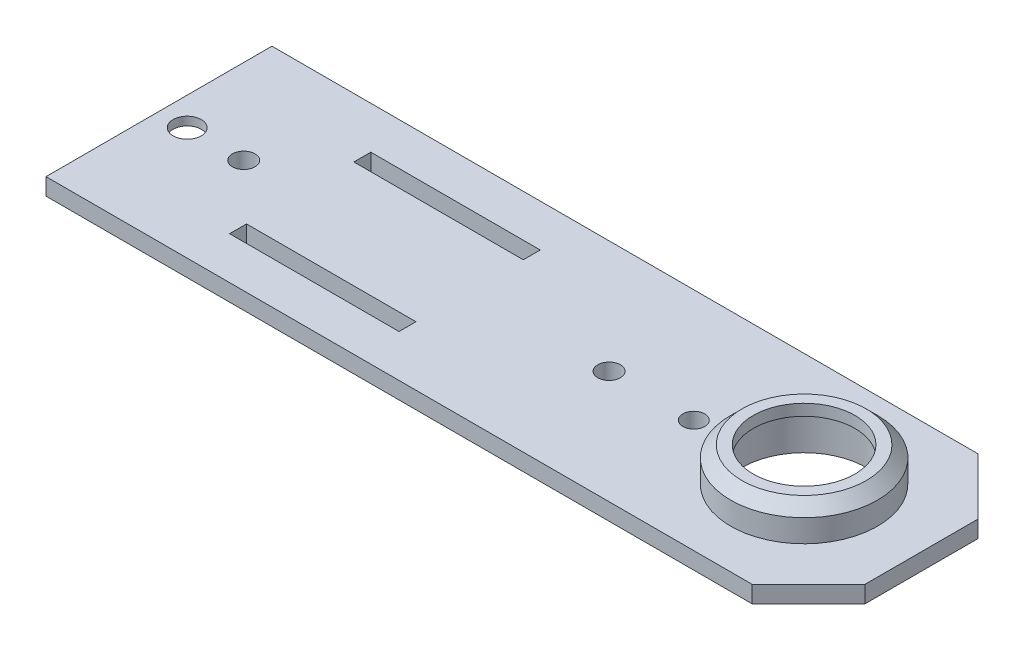
ISO-10303-21;
HEADER;
FILE_DESCRIPTION(('STEP AP214'),'2;1');
FILE_NAME('part.step','',(''),(''),'','','');
FILE_SCHEMA(('AUTOMOTIVE_DESIGN { 1 0 10303 214 1 1 1 1 }'));
ENDSEC;
DATA;
#1=APPLICATION_CONTEXT('core data for automotive mechanical design processes');
#2=APPLICATION_PROTOCOL_DEFINITION('international standard','automotive_design',2000,#1);
#3=PRODUCT_CONTEXT('',#1,'mechanical');
#4=PRODUCT('Part','Part','',(#3));
#5=PRODUCT_RELATED_PRODUCT_CATEGORY('part','',(#4));
#6=PRODUCT_DEFINITION_FORMATION('','',#4);
#7=PRODUCT_DEFINITION_CONTEXT('part definition',#1,'design');
#8=PRODUCT_DEFINITION('design','',#6,#7);
#9=PRODUCT_DEFINITION_SHAPE('','',#8);
#10=(LENGTH_UNIT() NAMED_UNIT(*) SI_UNIT(.MILLI.,.METRE.));
#11=(NAMED_UNIT(*) PLANE_ANGLE_UNIT() SI_UNIT($,.RADIAN.));
#12=(NAMED_UNIT(*) SI_UNIT($,.STERADIAN.) SOLID_ANGLE_UNIT());
#13=UNCERTAINTY_MEASURE_WITH_UNIT(LENGTH_MEASURE(1.E-05),#10,'distance_accuracy_value','');
#14=(GEOMETRIC_REPRESENTATION_CONTEXT(3) GLOBAL_UNCERTAINTY_ASSIGNED_CONTEXT((#13)) GLOBAL_UNIT_ASSIGNED_CONTEXT((#10,
#11,#12)) REPRESENTATION_CONTEXT('',''));
#15=CARTESIAN_POINT('',(0.,0.,0.));
#16=DIRECTION('',(0.,0.,1.));
#17=DIRECTION('',(1.,0.,0.));
#18=AXIS2_PLACEMENT_3D('',#15,#16,#17);
#19=CARTESIAN_POINT('',(-57.5,3.,-10.0000000000001));
#20=DIRECTION('',(0.,0.,-1.));
#21=DIRECTION('',(-1.,0.,0.));
#22=AXIS2_PLACEMENT_3D('',#19,#20,#21);
#23=PLANE('',#22);
#24=DIRECTION('',(-1.,0.,0.));
#25=VECTOR('',#24,1.);
#26=CARTESIAN_POINT('',(-67.5,1.5,-10.0000000000001));
#27=LINE('',#26,#25);
#28=CARTESIAN_POINT('',(-57.5,1.5,-10.0000000000001));
#29=VERTEX_POINT('',#28);
#30=CARTESIAN_POINT('',(-67.5,1.5,-10.0000000000001));
#31=VERTEX_POINT('',#30);
#32=EDGE_CURVE('E170',#29,#31,#27,.T.);
#33=ORIENTED_EDGE('',*,*,#32,.T.);
#34=DIRECTION('',(0.,-1.,0.));
#35=VECTOR('',#34,1.);
#36=CARTESIAN_POINT('',(-67.5,3.,-10.0000000000001));
#37=LINE('',#36,#35);
#38=CARTESIAN_POINT('',(-67.5,0.,-10.0000000000001));
#39=VERTEX_POINT('',#38);
#40=EDGE_CURVE('E188',#31,#39,#37,.T.);
#41=ORIENTED_EDGE('',*,*,#40,.T.);
#42=DIRECTION('',(1.,0.,0.));
#43=VECTOR('',#42,1.);
#44=CARTESIAN_POINT('',(-57.5,0.,-10.0000000000001));
#45=LINE('',#44,#43);
#46=CARTESIAN_POINT('',(-57.5,0.,-10.0000000000001));
#47=VERTEX_POINT('',#46);
#48=EDGE_CURVE('E266',#39,#47,#45,.T.);
#49=ORIENTED_EDGE('',*,*,#48,.T.);
#50=DIRECTION('',(0.,-1.,0.));
#51=VECTOR('',#50,1.);
#52=CARTESIAN_POINT('',(-57.5,3.,-10.0000000000001));
#53=LINE('',#52,#51);
#54=EDGE_CURVE('E186',#29,#47,#53,.T.);
#55=ORIENTED_EDGE('',*,*,#54,.F.);
#56=EDGE_LOOP('',(#33,#41,#49,#55));
#57=FACE_BOUND('',#56,.T.);
#58=ADVANCED_FACE('F38',(#57),#23,.F.);
#59=CARTESIAN_POINT('',(-57.5,3.,9.99999999999992));
#60=DIRECTION('',(1.,0.,0.));
#61=DIRECTION('',(0.,0.,-1.));
#62=AXIS2_PLACEMENT_3D('',#59,#60,#61);
#63=PLANE('',#62);
#64=DIRECTION('',(0.,0.,-1.));
#65=VECTOR('',#64,1.);
#66=CARTESIAN_POINT('',(-57.5,1.5,-10.0000000000001));
#67=LINE('',#66,#65);
#68=CARTESIAN_POINT('',(-57.5,1.5,9.99999999999992));
#69=VERTEX_POINT('',#68);
#70=EDGE_CURVE('E164',#69,#29,#67,.T.);
#71=ORIENTED_EDGE('',*,*,#70,.T.);
#72=ORIENTED_EDGE('',*,*,#54,.T.);
#73=DIRECTION('',(0.,0.,1.));
#74=VECTOR('',#73,1.);
#75=CARTESIAN_POINT('',(-57.5,0.,9.99999999999992));
#76=LINE('',#75,#74);
#77=CARTESIAN_POINT('',(-57.5,0.,9.99999999999992));
#78=VERTEX_POINT('',#77);
#79=EDGE_CURVE('E184',#47,#78,#76,.T.);
#80=ORIENTED_EDGE('',*,*,#79,.T.);
#81=DIRECTION('',(0.,-1.,0.));
#82=VECTOR('',#81,1.);
#83=CARTESIAN_POINT('',(-57.5,3.,9.99999999999992));
#84=LINE('',#83,#82);
#85=EDGE_CURVE('E178',#69,#78,#84,.T.);
#86=ORIENTED_EDGE('',*,*,#85,.F.);
#87=EDGE_LOOP('',(#71,#72,#80,#86));
#88=FACE_BOUND('',#87,.T.);
#89=ADVANCED_FACE('F182',(#88),#63,.F.);
#90=CARTESIAN_POINT('',(-67.5,3.,9.99999999999992));
#91=DIRECTION('',(0.,0.,1.));
#92=DIRECTION('',(1.,0.,0.));
#93=AXIS2_PLACEMENT_3D('',#90,#91,#92);
#94=PLANE('',#93);
#95=DIRECTION('',(1.,0.,0.));
#96=VECTOR('',#95,1.);
#97=CARTESIAN_POINT('',(-67.5,1.5,9.99999999999992));
#98=LINE('',#97,#96);
#99=CARTESIAN_POINT('',(-67.5,1.5,9.99999999999992));
#100=VERTEX_POINT('',#99);
#101=EDGE_CURVE('E167',#100,#69,#98,.T.);
#102=ORIENTED_EDGE('',*,*,#101,.T.);
#103=ORIENTED_EDGE('',*,*,#85,.T.);
#104=DIRECTION('',(-1.,0.,0.));
#105=VECTOR('',#104,1.);
#106=CARTESIAN_POINT('',(-67.5,0.,9.99999999999992));
#107=LINE('',#106,#105);
#108=CARTESIAN_POINT('',(-67.5,0.,9.99999999999992));
#109=VERTEX_POINT('',#108);
#110=EDGE_CURVE('E251',#78,#109,#107,.T.);
#111=ORIENTED_EDGE('',*,*,#110,.T.);
#112=DIRECTION('',(0.,-1.,0.));
#113=VECTOR('',#112,1.);
#114=CARTESIAN_POINT('',(-67.5,3.,9.99999999999992));
#115=LINE('',#114,#113);
#116=EDGE_CURVE('E180',#100,#109,#115,.T.);
#117=ORIENTED_EDGE('',*,*,#116,.F.);
#118=EDGE_LOOP('',(#102,#103,#111,#117));
#119=FACE_BOUND('',#118,.T.);
#120=ADVANCED_FACE('F176',(#119),#94,.F.);
#121=CARTESIAN_POINT('',(0.,3.,0.));
#122=DIRECTION('',(0.,-1.,0.));
#123=DIRECTION('',(0.,0.,-1.));
#124=AXIS2_PLACEMENT_3D('',#121,#122,#123);
#125=PLANE('',#124);
#126=DIRECTION('',(0.,0.,-1.));
#127=VECTOR('',#126,1.);
#128=CARTESIAN_POINT('',(-12.5,3.,12.5));
#129=LINE('',#128,#127);
#130=CARTESIAN_POINT('',(-12.5,3.,12.5));
#131=VERTEX_POINT('',#130);
#132=CARTESIAN_POINT('',(-12.5,3.,9.5));
#133=VERTEX_POINT('',#132);
#134=EDGE_CURVE('E291',#131,#133,#129,.T.);
#135=ORIENTED_EDGE('',*,*,#134,.F.);
#136=DIRECTION('',(1.,0.,0.));
#137=VECTOR('',#136,1.);
#138=CARTESIAN_POINT('',(-42.5,3.,12.5));
#139=LINE('',#138,#137);
#140=CARTESIAN_POINT('',(-42.5,3.,12.5));
#141=VERTEX_POINT('',#140);
#142=EDGE_CURVE('E299',#141,#131,#139,.T.);
#143=ORIENTED_EDGE('',*,*,#142,.F.);
#144=DIRECTION('',(0.,0.,1.));
#145=VECTOR('',#144,1.);
#146=CARTESIAN_POINT('',(-42.5,3.,12.5));
#147=LINE('',#146,#145);
#148=CARTESIAN_POINT('',(-42.5,3.,9.5));
#149=VERTEX_POINT('',#148);
#150=EDGE_CURVE('E296',#149,#141,#147,.T.);
#151=ORIENTED_EDGE('',*,*,#150,.F.);
#152=DIRECTION('',(-1.,0.,0.));
#153=VECTOR('',#152,1.);
#154=CARTESIAN_POINT('',(-42.5,3.,9.5));
#155=LINE('',#154,#153);
#156=EDGE_CURVE('E293',#133,#149,#155,.T.);
#157=ORIENTED_EDGE('',*,*,#156,.F.);
#158=EDGE_LOOP('',(#135,#143,#151,#157));
#159=FACE_BOUND('',#158,.T.);
#160=CARTESIAN_POINT('',(12.1857700369203,3.,0.));
#161=DIRECTION('',(0.,1.,0.));
#162=DIRECTION('',(0.,0.,1.));
#163=AXIS2_PLACEMENT_3D('',#160,#161,#162);
#164=CIRCLE('',#163,2.);
#165=CARTESIAN_POINT('',(12.1857700369203,3.,2.));
#166=VERTEX_POINT('',#165);
#167=EDGE_CURVE('E362',#166,#166,#164,.T.);
#168=ORIENTED_EDGE('',*,*,#167,.F.);
#169=EDGE_LOOP('',(#168));
#170=FACE_BOUND('',#169,.T.);
#171=CARTESIAN_POINT('',(27.1857700369203,3.,0.));
#172=DIRECTION('',(0.,1.,0.));
#173=DIRECTION('',(0.,0.,1.));
#174=AXIS2_PLACEMENT_3D('',#171,#172,#173);
#175=CIRCLE('',#174,1.93767259060063);
#176=CARTESIAN_POINT('',(27.1857700369203,3.,1.93767259060063));
#177=VERTEX_POINT('',#176);
#178=EDGE_CURVE('E261',#177,#177,#175,.T.);
#179=ORIENTED_EDGE('',*,*,#178,.F.);
#180=EDGE_LOOP('',(#179));
#181=FACE_BOUND('',#180,.T.);
#182=DIRECTION('',(1.,0.,0.));
#183=VECTOR('',#182,1.);
#184=CARTESIAN_POINT('',(-67.5,3.,20.));
#185=LINE('',#184,#183);
#186=CARTESIAN_POINT('',(-67.5,3.,20.));
#187=VERTEX_POINT('',#186);
#188=CARTESIAN_POINT('',(57.5,3.,20.));
#189=VERTEX_POINT('',#188);
#190=EDGE_CURVE('E225',#187,#189,#185,.T.);
#191=ORIENTED_EDGE('',*,*,#190,.T.);
#192=DIRECTION('',(-0.707106781186548,0.,0.707106781186547));
#193=VECTOR('',#192,1.);
#194=CARTESIAN_POINT('',(67.5,3.,9.99999999999999));
#195=LINE('',#194,#193);
#196=CARTESIAN_POINT('',(67.5,3.,9.99999999999999));
#197=VERTEX_POINT('',#196);
#198=EDGE_CURVE('E47',#189,#197,#195,.F.);
#199=ORIENTED_EDGE('',*,*,#198,.T.);
#200=DIRECTION('',(0.,0.,-1.));
#201=VECTOR('',#200,1.);
#202=CARTESIAN_POINT('',(67.5,3.,20.));
#203=LINE('',#202,#201);
#204=CARTESIAN_POINT('',(67.5,3.,-9.99999999999995));
#205=VERTEX_POINT('',#204);
#206=EDGE_CURVE('E223',#197,#205,#203,.T.);
#207=ORIENTED_EDGE('',*,*,#206,.T.);
#208=DIRECTION('',(0.707106781186546,0.,0.707106781186549));
#209=VECTOR('',#208,1.);
#210=CARTESIAN_POINT('',(57.5,3.,-20.));
#211=LINE('',#210,#209);
#212=CARTESIAN_POINT('',(57.5,3.,-20.));
#213=VERTEX_POINT('',#212);
#214=EDGE_CURVE('E62',#205,#213,#211,.F.);
#215=ORIENTED_EDGE('',*,*,#214,.T.);
#216=DIRECTION('',(-1.,0.,0.));
#217=VECTOR('',#216,1.);
#218=CARTESIAN_POINT('',(-67.5,3.,-20.));
#219=LINE('',#218,#217);
#220=CARTESIAN_POINT('',(-67.5,3.,-20.));
#221=VERTEX_POINT('',#220);
#222=EDGE_CURVE('E234',#213,#221,#219,.T.);
#223=ORIENTED_EDGE('',*,*,#222,.T.);
#224=DIRECTION('',(0.,0.,1.));
#225=VECTOR('',#224,1.);
#226=CARTESIAN_POINT('',(-67.5,3.,-10.0000000000001));
#227=LINE('',#226,#225);
#228=EDGE_CURVE('E254',#221,#187,#227,.T.);
#229=ORIENTED_EDGE('',*,*,#228,.T.);
#230=EDGE_LOOP('',(#191,#199,#207,#215,#223,#229));
#231=FACE_BOUND('',#230,.T.);
#232=DIRECTION('',(0.,0.,-1.));
#233=VECTOR('',#232,1.);
#234=CARTESIAN_POINT('',(-12.5,3.,-9.5));
#235=LINE('',#234,#233);
#236=CARTESIAN_POINT('',(-12.5,3.,-9.5));
#237=VERTEX_POINT('',#236);
#238=CARTESIAN_POINT('',(-12.5,3.,-12.5));
#239=VERTEX_POINT('',#238);
#240=EDGE_CURVE('E328',#237,#239,#235,.T.);
#241=ORIENTED_EDGE('',*,*,#240,.F.);
#242=DIRECTION('',(1.,0.,0.));
#243=VECTOR('',#242,1.);
#244=CARTESIAN_POINT('',(-42.5,3.,-9.5));
#245=LINE('',#244,#243);
#246=CARTESIAN_POINT('',(-42.5,3.,-9.5));
#247=VERTEX_POINT('',#246);
#248=EDGE_CURVE('E336',#247,#237,#245,.T.);
#249=ORIENTED_EDGE('',*,*,#248,.F.);
#250=DIRECTION('',(0.,0.,1.));
#251=VECTOR('',#250,1.);
#252=CARTESIAN_POINT('',(-42.5,3.,-9.5));
#253=LINE('',#252,#251);
#254=CARTESIAN_POINT('',(-42.5,3.,-12.5));
#255=VERTEX_POINT('',#254);
#256=EDGE_CURVE('E333',#255,#247,#253,.T.);
#257=ORIENTED_EDGE('',*,*,#256,.F.);
#258=DIRECTION('',(-1.,0.,0.));
#259=VECTOR('',#258,1.);
#260=CARTESIAN_POINT('',(-42.5,3.,-12.5));
#261=LINE('',#260,#259);
#262=EDGE_CURVE('E330',#239,#255,#261,.T.);
#263=ORIENTED_EDGE('',*,*,#262,.F.);
#264=EDGE_LOOP('',(#241,#249,#257,#263));
#265=FACE_BOUND('',#264,.T.);
#266=CARTESIAN_POINT('',(-52.5,3.,0.));
#267=DIRECTION('',(0.,1.,0.));
#268=DIRECTION('',(0.,0.,1.));
#269=AXIS2_PLACEMENT_3D('',#266,#267,#268);
#270=CIRCLE('',#269,2.);
#271=CARTESIAN_POINT('',(-52.5,3.,2.));
#272=VERTEX_POINT('',#271);
#273=EDGE_CURVE('E322',#272,#272,#270,.T.);
#274=ORIENTED_EDGE('',*,*,#273,.F.);
#275=EDGE_LOOP('',(#274));
#276=FACE_BOUND('',#275,.T.);
#277=CARTESIAN_POINT('',(46.7139511037718,3.,0.));
#278=DIRECTION('',(0.,-1.,0.));
#279=DIRECTION('',(0.,0.,-1.));
#280=AXIS2_PLACEMENT_3D('',#277,#278,#279);
#281=CIRCLE('',#280,13.);
#282=CARTESIAN_POINT('',(46.7139511037718,3.,-13.));
#283=VERTEX_POINT('',#282);
#284=EDGE_CURVE('E198',#283,#283,#281,.F.);
#285=ORIENTED_EDGE('',*,*,#284,.F.);
#286=EDGE_LOOP('',(#285));
#287=FACE_BOUND('',#286,.T.);
#288=CARTESIAN_POINT('',(-62.5,3.,0.));
#289=DIRECTION('',(0.,1.,0.));
#290=DIRECTION('',(0.,0.,1.));
#291=AXIS2_PLACEMENT_3D('',#288,#289,#290);
#292=CIRCLE('',#291,2.5);
#293=CARTESIAN_POINT('',(-62.5,3.,2.49999999999993));
#294=VERTEX_POINT('',#293);
#295=EDGE_CURVE('E755',#294,#294,#292,.T.);
#296=ORIENTED_EDGE('',*,*,#295,.F.);
#297=EDGE_LOOP('',(#296));
#298=FACE_BOUND('',#297,.T.);
#299=ADVANCED_FACE('F221',(#159,#170,#181,#231,#265,#276,#287,#298),#125,.F.);
#300=CARTESIAN_POINT('',(0.,0.,0.));
#301=DIRECTION('',(0.,-1.,0.));
#302=DIRECTION('',(0.,0.,-1.));
#303=AXIS2_PLACEMENT_3D('',#300,#301,#302);
#304=PLANE('',#303);
#305=DIRECTION('',(1.,0.,0.));
#306=VECTOR('',#305,1.);
#307=CARTESIAN_POINT('',(-42.5,0.,-9.5));
#308=LINE('',#307,#306);
#309=CARTESIAN_POINT('',(-42.5,0.,-9.5));
#310=VERTEX_POINT('',#309);
#311=CARTESIAN_POINT('',(-12.5,0.,-9.5));
#312=VERTEX_POINT('',#311);
#313=EDGE_CURVE('E331',#310,#312,#308,.T.);
#314=ORIENTED_EDGE('',*,*,#313,.T.);
#315=DIRECTION('',(0.,0.,-1.));
#316=VECTOR('',#315,1.);
#317=CARTESIAN_POINT('',(-12.5,0.,-9.5));
#318=LINE('',#317,#316);
#319=CARTESIAN_POINT('',(-12.5,0.,-12.5));
#320=VERTEX_POINT('',#319);
#321=EDGE_CURVE('E325',#312,#320,#318,.T.);
#322=ORIENTED_EDGE('',*,*,#321,.T.);
#323=DIRECTION('',(-1.,0.,0.));
#324=VECTOR('',#323,1.);
#325=CARTESIAN_POINT('',(-42.5,0.,-12.5));
#326=LINE('',#325,#324);
#327=CARTESIAN_POINT('',(-42.5,0.,-12.5));
#328=VERTEX_POINT('',#327);
#329=EDGE_CURVE('E341',#320,#328,#326,.T.);
#330=ORIENTED_EDGE('',*,*,#329,.T.);
#331=DIRECTION('',(0.,0.,1.));
#332=VECTOR('',#331,1.);
#333=CARTESIAN_POINT('',(-42.5,0.,-9.5));
#334=LINE('',#333,#332);
#335=EDGE_CURVE('E344',#328,#310,#334,.T.);
#336=ORIENTED_EDGE('',*,*,#335,.T.);
#337=EDGE_LOOP('',(#314,#322,#330,#336));
#338=FACE_BOUND('',#337,.T.);
#339=CARTESIAN_POINT('',(46.7139511037718,0.,0.));
#340=DIRECTION('',(0.,1.,0.));
#341=DIRECTION('',(0.,0.,1.));
#342=AXIS2_PLACEMENT_3D('',#339,#340,#341);
#343=CIRCLE('',#342,11.);
#344=CARTESIAN_POINT('',(46.7139511037718,0.,11.));
#345=VERTEX_POINT('',#344);
#346=EDGE_CURVE('E358',#345,#345,#343,.T.);
#347=ORIENTED_EDGE('',*,*,#346,.T.);
#348=EDGE_LOOP('',(#347));
#349=FACE_BOUND('',#348,.T.);
#350=CARTESIAN_POINT('',(27.1857700369203,0.,0.));
#351=DIRECTION('',(0.,1.,0.));
#352=DIRECTION('',(0.,0.,1.));
#353=AXIS2_PLACEMENT_3D('',#350,#351,#352);
#354=CIRCLE('',#353,1.93767259060063);
#355=CARTESIAN_POINT('',(27.1857700369203,0.,1.93767259060063));
#356=VERTEX_POINT('',#355);
#357=EDGE_CURVE('E365',#356,#356,#354,.T.);
#358=ORIENTED_EDGE('',*,*,#357,.T.);
#359=EDGE_LOOP('',(#358));
#360=FACE_BOUND('',#359,.T.);
#361=DIRECTION('',(0.,0.,-1.));
#362=VECTOR('',#361,1.);
#363=CARTESIAN_POINT('',(67.5,0.,20.));
#364=LINE('',#363,#362);
#365=CARTESIAN_POINT('',(67.5,0.,9.99999999999999));
#366=VERTEX_POINT('',#365);
#367=CARTESIAN_POINT('',(67.5,0.,-9.99999999999995));
#368=VERTEX_POINT('',#367);
#369=EDGE_CURVE('E244',#366,#368,#364,.T.);
#370=ORIENTED_EDGE('',*,*,#369,.F.);
#371=DIRECTION('',(0.707106781186548,0.,-0.707106781186547));
#372=VECTOR('',#371,1.);
#373=CARTESIAN_POINT('',(38.75,0.,38.75));
#374=LINE('',#373,#372);
#375=CARTESIAN_POINT('',(57.5,0.,20.));
#376=VERTEX_POINT('',#375);
#377=EDGE_CURVE('E214',#366,#376,#374,.F.);
#378=ORIENTED_EDGE('',*,*,#377,.T.);
#379=DIRECTION('',(1.,0.,0.));
#380=VECTOR('',#379,1.);
#381=CARTESIAN_POINT('',(-67.5,0.,20.));
#382=LINE('',#381,#380);
#383=CARTESIAN_POINT('',(-67.5,0.,20.));
#384=VERTEX_POINT('',#383);
#385=EDGE_CURVE('E235',#384,#376,#382,.T.);
#386=ORIENTED_EDGE('',*,*,#385,.F.);
#387=DIRECTION('',(0.,0.,1.));
#388=VECTOR('',#387,1.);
#389=CARTESIAN_POINT('',(-67.5,0.,20.));
#390=LINE('',#389,#388);
#391=EDGE_CURVE('E249',#109,#384,#390,.T.);
#392=ORIENTED_EDGE('',*,*,#391,.F.);
#393=ORIENTED_EDGE('',*,*,#110,.F.);
#394=ORIENTED_EDGE('',*,*,#79,.F.);
#395=ORIENTED_EDGE('',*,*,#48,.F.);
#396=DIRECTION('',(0.,0.,1.));
#397=VECTOR('',#396,1.);
#398=CARTESIAN_POINT('',(-67.5,0.,-10.0000000000001));
#399=LINE('',#398,#397);
#400=CARTESIAN_POINT('',(-67.5,0.,-20.));
#401=VERTEX_POINT('',#400);
#402=EDGE_CURVE('E263',#401,#39,#399,.T.);
#403=ORIENTED_EDGE('',*,*,#402,.F.);
#404=DIRECTION('',(-1.,0.,0.));
#405=VECTOR('',#404,1.);
#406=CARTESIAN_POINT('',(-67.5,0.,-20.));
#407=LINE('',#406,#405);
#408=CARTESIAN_POINT('',(57.5,0.,-20.));
#409=VERTEX_POINT('',#408);
#410=EDGE_CURVE('E260',#409,#401,#407,.T.);
#411=ORIENTED_EDGE('',*,*,#410,.F.);
#412=DIRECTION('',(-0.707106781186546,0.,-0.707106781186549));
#413=VECTOR('',#412,1.);
#414=CARTESIAN_POINT('',(38.7500000000001,0.,-38.75));
#415=LINE('',#414,#413);
#416=EDGE_CURVE('E212',#409,#368,#415,.F.);
#417=ORIENTED_EDGE('',*,*,#416,.T.);
#418=EDGE_LOOP('',(#370,#378,#386,#392,#393,#394,#395,#403,#411,#417));
#419=FACE_BOUND('',#418,.T.);
#420=CARTESIAN_POINT('',(12.1857700369203,0.,0.));
#421=DIRECTION('',(0.,1.,0.));
#422=DIRECTION('',(0.,0.,1.));
#423=AXIS2_PLACEMENT_3D('',#420,#421,#422);
#424=CIRCLE('',#423,2.);
#425=CARTESIAN_POINT('',(12.1857700369203,0.,2.));
#426=VERTEX_POINT('',#425);
#427=EDGE_CURVE('E361',#426,#426,#424,.T.);
#428=ORIENTED_EDGE('',*,*,#427,.T.);
#429=EDGE_LOOP('',(#428));
#430=FACE_BOUND('',#429,.T.);
#431=CARTESIAN_POINT('',(-52.5,0.,0.));
#432=DIRECTION('',(0.,1.,0.));
#433=DIRECTION('',(0.,0.,1.));
#434=AXIS2_PLACEMENT_3D('',#431,#432,#433);
#435=CIRCLE('',#434,2.);
#436=CARTESIAN_POINT('',(-52.5,0.,2.));
#437=VERTEX_POINT('',#436);
#438=EDGE_CURVE('E321',#437,#437,#435,.T.);
#439=ORIENTED_EDGE('',*,*,#438,.T.);
#440=EDGE_LOOP('',(#439));
#441=FACE_BOUND('',#440,.T.);
#442=DIRECTION('',(1.,0.,0.));
#443=VECTOR('',#442,1.);
#444=CARTESIAN_POINT('',(-42.5,0.,12.5));
#445=LINE('',#444,#443);
#446=CARTESIAN_POINT('',(-42.5,0.,12.5));
#447=VERTEX_POINT('',#446);
#448=CARTESIAN_POINT('',(-12.5,0.,12.5));
#449=VERTEX_POINT('',#448);
#450=EDGE_CURVE('E294',#447,#449,#445,.T.);
#451=ORIENTED_EDGE('',*,*,#450,.T.);
#452=DIRECTION('',(0.,0.,-1.));
#453=VECTOR('',#452,1.);
#454=CARTESIAN_POINT('',(-12.5,0.,12.5));
#455=LINE('',#454,#453);
#456=CARTESIAN_POINT('',(-12.5,0.,9.5));
#457=VERTEX_POINT('',#456);
#458=EDGE_CURVE('E290',#449,#457,#455,.T.);
#459=ORIENTED_EDGE('',*,*,#458,.T.);
#460=DIRECTION('',(-1.,0.,0.));
#461=VECTOR('',#460,1.);
#462=CARTESIAN_POINT('',(-42.5,0.,9.5));
#463=LINE('',#462,#461);
#464=CARTESIAN_POINT('',(-42.5,0.,9.5));
#465=VERTEX_POINT('',#464);
#466=EDGE_CURVE('E304',#457,#465,#463,.T.);
#467=ORIENTED_EDGE('',*,*,#466,.T.);
#468=DIRECTION('',(0.,0.,1.));
#469=VECTOR('',#468,1.);
#470=CARTESIAN_POINT('',(-42.5,0.,12.5));
#471=LINE('',#470,#469);
#472=EDGE_CURVE('E307',#465,#447,#471,.T.);
#473=ORIENTED_EDGE('',*,*,#472,.T.);
#474=EDGE_LOOP('',(#451,#459,#467,#473));
#475=FACE_BOUND('',#474,.T.);
#476=ADVANCED_FACE('F241',(#338,#349,#360,#419,#430,#441,#475),#304,.T.);
#477=CARTESIAN_POINT('',(67.5,3.,20.));
#478=DIRECTION('',(-1.,0.,0.));
#479=DIRECTION('',(0.,0.,1.));
#480=AXIS2_PLACEMENT_3D('',#477,#478,#479);
#481=PLANE('',#480);
#482=ORIENTED_EDGE('',*,*,#206,.F.);
#483=DIRECTION('',(0.,-1.,0.));
#484=VECTOR('',#483,1.);
#485=CARTESIAN_POINT('',(67.5,3.,9.99999999999999));
#486=LINE('',#485,#484);
#487=EDGE_CURVE('E209',#197,#366,#486,.T.);
#488=ORIENTED_EDGE('',*,*,#487,.T.);
#489=ORIENTED_EDGE('',*,*,#369,.T.);
#490=DIRECTION('',(0.,1.,0.));
#491=VECTOR('',#490,1.);
#492=CARTESIAN_POINT('',(67.5,3.,-9.99999999999995));
#493=LINE('',#492,#491);
#494=EDGE_CURVE('E207',#368,#205,#493,.T.);
#495=ORIENTED_EDGE('',*,*,#494,.T.);
#496=EDGE_LOOP('',(#482,#488,#489,#495));
#497=FACE_BOUND('',#496,.T.);
#498=ADVANCED_FACE('F230',(#497),#481,.F.);
#499=CARTESIAN_POINT('',(-67.5,3.,-20.));
#500=DIRECTION('',(0.,0.,1.));
#501=DIRECTION('',(1.,0.,0.));
#502=AXIS2_PLACEMENT_3D('',#499,#500,#501);
#503=PLANE('',#502);
#504=ORIENTED_EDGE('',*,*,#222,.F.);
#505=DIRECTION('',(0.,-1.,0.));
#506=VECTOR('',#505,1.);
#507=CARTESIAN_POINT('',(57.5,3.,-20.));
#508=LINE('',#507,#506);
#509=EDGE_CURVE('E11',#213,#409,#508,.T.);
#510=ORIENTED_EDGE('',*,*,#509,.T.);
#511=ORIENTED_EDGE('',*,*,#410,.T.);
#512=DIRECTION('',(0.,-1.,0.));
#513=VECTOR('',#512,1.);
#514=CARTESIAN_POINT('',(-67.5,3.,-20.));
#515=LINE('',#514,#513);
#516=EDGE_CURVE('E195',#221,#401,#515,.T.);
#517=ORIENTED_EDGE('',*,*,#516,.F.);
#518=EDGE_LOOP('',(#504,#510,#511,#517));
#519=FACE_BOUND('',#518,.T.);
#520=ADVANCED_FACE('F275',(#519),#503,.F.);
#521=CARTESIAN_POINT('',(-67.5,3.,20.));
#522=DIRECTION('',(1.,0.,0.));
#523=DIRECTION('',(0.,0.,-1.));
#524=AXIS2_PLACEMENT_3D('',#521,#522,#523);
#525=PLANE('',#524);
#526=ORIENTED_EDGE('',*,*,#391,.T.);
#527=DIRECTION('',(0.,-1.,0.));
#528=VECTOR('',#527,1.);
#529=CARTESIAN_POINT('',(-67.5,3.,20.));
#530=LINE('',#529,#528);
#531=EDGE_CURVE('E190',#187,#384,#530,.T.);
#532=ORIENTED_EDGE('',*,*,#531,.F.);
#533=ORIENTED_EDGE('',*,*,#228,.F.);
#534=ORIENTED_EDGE('',*,*,#516,.T.);
#535=ORIENTED_EDGE('',*,*,#402,.T.);
#536=ORIENTED_EDGE('',*,*,#40,.F.);
#537=DIRECTION('',(0.,0.,1.));
#538=VECTOR('',#537,1.);
#539=CARTESIAN_POINT('',(-67.5,1.5,-10.0000000000001));
#540=LINE('',#539,#538);
#541=EDGE_CURVE('E54',#31,#100,#540,.T.);
#542=ORIENTED_EDGE('',*,*,#541,.T.);
#543=ORIENTED_EDGE('',*,*,#116,.T.);
#544=EDGE_LOOP('',(#526,#532,#533,#534,#535,#536,#542,#543));
#545=FACE_BOUND('',#544,.T.);
#546=ADVANCED_FACE('F269',(#545),#525,.F.);
#547=CARTESIAN_POINT('',(-67.5,3.,20.));
#548=DIRECTION('',(0.,0.,-1.));
#549=DIRECTION('',(-1.,0.,0.));
#550=AXIS2_PLACEMENT_3D('',#547,#548,#549);
#551=PLANE('',#550);
#552=ORIENTED_EDGE('',*,*,#385,.T.);
#553=DIRECTION('',(0.,1.,0.));
#554=VECTOR('',#553,1.);
#555=CARTESIAN_POINT('',(57.5,3.,20.));
#556=LINE('',#555,#554);
#557=EDGE_CURVE('E216',#376,#189,#556,.T.);
#558=ORIENTED_EDGE('',*,*,#557,.T.);
#559=ORIENTED_EDGE('',*,*,#190,.F.);
#560=ORIENTED_EDGE('',*,*,#531,.T.);
#561=EDGE_LOOP('',(#552,#558,#559,#560));
#562=FACE_BOUND('',#561,.T.);
#563=ADVANCED_FACE('F247',(#562),#551,.F.);
#564=CARTESIAN_POINT('',(27.1857700369203,3.,0.));
#565=DIRECTION('',(0.,-1.,0.));
#566=DIRECTION('',(0.,0.,-1.));
#567=AXIS2_PLACEMENT_3D('',#564,#565,#566);
#568=CYLINDRICAL_SURFACE('',#567,1.93767259060063);
#569=ORIENTED_EDGE('',*,*,#178,.T.);
#570=EDGE_LOOP('',(#569));
#571=FACE_BOUND('',#570,.T.);
#572=ORIENTED_EDGE('',*,*,#357,.F.);
#573=EDGE_LOOP('',(#572));
#574=FACE_BOUND('',#573,.T.);
#575=ADVANCED_FACE('F374',(#571,#574),#568,.F.);
#576=CARTESIAN_POINT('',(12.1857700369203,3.,0.));
#577=DIRECTION('',(0.,-1.,0.));
#578=DIRECTION('',(0.,0.,-1.));
#579=AXIS2_PLACEMENT_3D('',#576,#577,#578);
#580=CYLINDRICAL_SURFACE('',#579,2.);
#581=ORIENTED_EDGE('',*,*,#167,.T.);
#582=EDGE_LOOP('',(#581));
#583=FACE_BOUND('',#582,.T.);
#584=ORIENTED_EDGE('',*,*,#427,.F.);
#585=EDGE_LOOP('',(#584));
#586=FACE_BOUND('',#585,.T.);
#587=ADVANCED_FACE('F376',(#583,#586),#580,.F.);
#588=CARTESIAN_POINT('',(46.7139511037718,3.,0.));
#589=DIRECTION('',(0.,-1.,0.));
#590=DIRECTION('',(0.,0.,-1.));
#591=AXIS2_PLACEMENT_3D('',#588,#589,#590);
#592=CYLINDRICAL_SURFACE('',#591,11.);
#593=ORIENTED_EDGE('',*,*,#346,.F.);
#594=EDGE_LOOP('',(#593));
#595=FACE_BOUND('',#594,.T.);
#596=CARTESIAN_POINT('',(46.7139511037718,7.,0.));
#597=DIRECTION('',(0.,1.,0.));
#598=DIRECTION('',(0.,0.,1.));
#599=AXIS2_PLACEMENT_3D('',#596,#597,#598);
#600=CIRCLE('',#599,11.);
#601=CARTESIAN_POINT('',(46.7139511037718,7.,11.));
#602=VERTEX_POINT('',#601);
#603=EDGE_CURVE('E286',#602,#602,#600,.T.);
#604=ORIENTED_EDGE('',*,*,#603,.T.);
#605=EDGE_LOOP('',(#604));
#606=FACE_BOUND('',#605,.T.);
#607=ADVANCED_FACE('F383',(#595,#606),#592,.F.);
#608=CARTESIAN_POINT('',(-12.5,3.,-9.5));
#609=DIRECTION('',(-1.,0.,0.));
#610=DIRECTION('',(0.,0.,1.));
#611=AXIS2_PLACEMENT_3D('',#608,#609,#610);
#612=PLANE('',#611);
#613=ORIENTED_EDGE('',*,*,#321,.F.);
#614=DIRECTION('',(0.,-1.,0.));
#615=VECTOR('',#614,1.);
#616=CARTESIAN_POINT('',(-12.5,3.,-9.5));
#617=LINE('',#616,#615);
#618=EDGE_CURVE('E338',#237,#312,#617,.T.);
#619=ORIENTED_EDGE('',*,*,#618,.F.);
#620=ORIENTED_EDGE('',*,*,#240,.T.);
#621=DIRECTION('',(0.,-1.,0.));
#622=VECTOR('',#621,1.);
#623=CARTESIAN_POINT('',(-12.5,3.,-12.5));
#624=LINE('',#623,#622);
#625=EDGE_CURVE('E355',#239,#320,#624,.T.);
#626=ORIENTED_EDGE('',*,*,#625,.T.);
#627=EDGE_LOOP('',(#613,#619,#620,#626));
#628=FACE_BOUND('',#627,.T.);
#629=ADVANCED_FACE('F474',(#628),#612,.T.);
#630=CARTESIAN_POINT('',(-42.5,3.,-12.5));
#631=DIRECTION('',(0.,0.,1.));
#632=DIRECTION('',(1.,0.,0.));
#633=AXIS2_PLACEMENT_3D('',#630,#631,#632);
#634=PLANE('',#633);
#635=ORIENTED_EDGE('',*,*,#329,.F.);
#636=ORIENTED_EDGE('',*,*,#625,.F.);
#637=ORIENTED_EDGE('',*,*,#262,.T.);
#638=DIRECTION('',(0.,-1.,0.));
#639=VECTOR('',#638,1.);
#640=CARTESIAN_POINT('',(-42.5,3.,-12.5));
#641=LINE('',#640,#639);
#642=EDGE_CURVE('E353',#255,#328,#641,.T.);
#643=ORIENTED_EDGE('',*,*,#642,.T.);
#644=EDGE_LOOP('',(#635,#636,#637,#643));
#645=FACE_BOUND('',#644,.T.);
#646=ADVANCED_FACE('F470',(#645),#634,.T.);
#647=CARTESIAN_POINT('',(-42.5,3.,-9.5));
#648=DIRECTION('',(1.,0.,0.));
#649=DIRECTION('',(0.,0.,-1.));
#650=AXIS2_PLACEMENT_3D('',#647,#648,#649);
#651=PLANE('',#650);
#652=ORIENTED_EDGE('',*,*,#335,.F.);
#653=ORIENTED_EDGE('',*,*,#642,.F.);
#654=ORIENTED_EDGE('',*,*,#256,.T.);
#655=DIRECTION('',(0.,-1.,0.));
#656=VECTOR('',#655,1.);
#657=CARTESIAN_POINT('',(-42.5,3.,-9.5));
#658=LINE('',#657,#656);
#659=EDGE_CURVE('E351',#247,#310,#658,.T.);
#660=ORIENTED_EDGE('',*,*,#659,.T.);
#661=EDGE_LOOP('',(#652,#653,#654,#660));
#662=FACE_BOUND('',#661,.T.);
#663=ADVANCED_FACE('F466',(#662),#651,.T.);
#664=CARTESIAN_POINT('',(-42.5,3.,-9.5));
#665=DIRECTION('',(0.,0.,-1.));
#666=DIRECTION('',(-1.,0.,0.));
#667=AXIS2_PLACEMENT_3D('',#664,#665,#666);
#668=PLANE('',#667);
#669=ORIENTED_EDGE('',*,*,#313,.F.);
#670=ORIENTED_EDGE('',*,*,#659,.F.);
#671=ORIENTED_EDGE('',*,*,#248,.T.);
#672=ORIENTED_EDGE('',*,*,#618,.T.);
#673=EDGE_LOOP('',(#669,#670,#671,#672));
#674=FACE_BOUND('',#673,.T.);
#675=ADVANCED_FACE('F462',(#674),#668,.T.);
#676=CARTESIAN_POINT('',(-52.5,3.,0.));
#677=DIRECTION('',(0.,-1.,0.));
#678=DIRECTION('',(0.,0.,-1.));
#679=AXIS2_PLACEMENT_3D('',#676,#677,#678);
#680=CYLINDRICAL_SURFACE('',#679,2.);
#681=ORIENTED_EDGE('',*,*,#273,.T.);
#682=EDGE_LOOP('',(#681));
#683=FACE_BOUND('',#682,.T.);
#684=ORIENTED_EDGE('',*,*,#438,.F.);
#685=EDGE_LOOP('',(#684));
#686=FACE_BOUND('',#685,.T.);
#687=ADVANCED_FACE('F458',(#683,#686),#680,.F.);
#688=CARTESIAN_POINT('',(-12.5,3.,12.5));
#689=DIRECTION('',(-1.,0.,0.));
#690=DIRECTION('',(0.,0.,1.));
#691=AXIS2_PLACEMENT_3D('',#688,#689,#690);
#692=PLANE('',#691);
#693=ORIENTED_EDGE('',*,*,#458,.F.);
#694=DIRECTION('',(0.,-1.,0.));
#695=VECTOR('',#694,1.);
#696=CARTESIAN_POINT('',(-12.5,3.,12.5));
#697=LINE('',#696,#695);
#698=EDGE_CURVE('E301',#131,#449,#697,.T.);
#699=ORIENTED_EDGE('',*,*,#698,.F.);
#700=ORIENTED_EDGE('',*,*,#134,.T.);
#701=DIRECTION('',(0.,-1.,0.));
#702=VECTOR('',#701,1.);
#703=CARTESIAN_POINT('',(-12.5,3.,9.5));
#704=LINE('',#703,#702);
#705=EDGE_CURVE('E318',#133,#457,#704,.T.);
#706=ORIENTED_EDGE('',*,*,#705,.T.);
#707=EDGE_LOOP('',(#693,#699,#700,#706));
#708=FACE_BOUND('',#707,.T.);
#709=ADVANCED_FACE('F454',(#708),#692,.T.);
#710=CARTESIAN_POINT('',(-42.5,3.,9.5));
#711=DIRECTION('',(0.,0.,1.));
#712=DIRECTION('',(1.,0.,0.));
#713=AXIS2_PLACEMENT_3D('',#710,#711,#712);
#714=PLANE('',#713);
#715=ORIENTED_EDGE('',*,*,#466,.F.);
#716=ORIENTED_EDGE('',*,*,#705,.F.);
#717=ORIENTED_EDGE('',*,*,#156,.T.);
#718=DIRECTION('',(0.,-1.,0.));
#719=VECTOR('',#718,1.);
#720=CARTESIAN_POINT('',(-42.5,3.,9.5));
#721=LINE('',#720,#719);
#722=EDGE_CURVE('E316',#149,#465,#721,.T.);
#723=ORIENTED_EDGE('',*,*,#722,.T.);
#724=EDGE_LOOP('',(#715,#716,#717,#723));
#725=FACE_BOUND('',#724,.T.);
#726=ADVANCED_FACE('F450',(#725),#714,.T.);
#727=CARTESIAN_POINT('',(-42.5,3.,12.5));
#728=DIRECTION('',(1.,0.,0.));
#729=DIRECTION('',(0.,0.,-1.));
#730=AXIS2_PLACEMENT_3D('',#727,#728,#729);
#731=PLANE('',#730);
#732=ORIENTED_EDGE('',*,*,#472,.F.);
#733=ORIENTED_EDGE('',*,*,#722,.F.);
#734=ORIENTED_EDGE('',*,*,#150,.T.);
#735=DIRECTION('',(0.,-1.,0.));
#736=VECTOR('',#735,1.);
#737=CARTESIAN_POINT('',(-42.5,3.,12.5));
#738=LINE('',#737,#736);
#739=EDGE_CURVE('E314',#141,#447,#738,.T.);
#740=ORIENTED_EDGE('',*,*,#739,.T.);
#741=EDGE_LOOP('',(#732,#733,#734,#740));
#742=FACE_BOUND('',#741,.T.);
#743=ADVANCED_FACE('F446',(#742),#731,.T.);
#744=CARTESIAN_POINT('',(-42.5,3.,12.5));
#745=DIRECTION('',(0.,0.,-1.));
#746=DIRECTION('',(-1.,0.,0.));
#747=AXIS2_PLACEMENT_3D('',#744,#745,#746);
#748=PLANE('',#747);
#749=ORIENTED_EDGE('',*,*,#450,.F.);
#750=ORIENTED_EDGE('',*,*,#739,.F.);
#751=ORIENTED_EDGE('',*,*,#142,.T.);
#752=ORIENTED_EDGE('',*,*,#698,.T.);
#753=EDGE_LOOP('',(#749,#750,#751,#752));
#754=FACE_BOUND('',#753,.T.);
#755=ADVANCED_FACE('F442',(#754),#748,.T.);
#756=CARTESIAN_POINT('',(46.7139511037718,7.,0.));
#757=DIRECTION('',(0.,-1.,0.));
#758=DIRECTION('',(0.,0.,-1.));
#759=AXIS2_PLACEMENT_3D('',#756,#757,#758);
#760=CYLINDRICAL_SURFACE('',#759,13.);
#761=CARTESIAN_POINT('',(46.7139511037718,7.00000000000001,0.));
#762=DIRECTION('',(0.,1.,0.));
#763=DIRECTION('',(0.,0.,1.));
#764=AXIS2_PLACEMENT_3D('',#761,#762,#763);
#765=CIRCLE('',#764,13.);
#766=CARTESIAN_POINT('',(46.7139511037718,7.00000000000001,13.));
#767=VERTEX_POINT('',#766);
#768=EDGE_CURVE('E204',#767,#767,#765,.F.);
#769=ORIENTED_EDGE('',*,*,#768,.T.);
#770=EDGE_LOOP('',(#769));
#771=FACE_BOUND('',#770,.T.);
#772=ORIENTED_EDGE('',*,*,#284,.T.);
#773=EDGE_LOOP('',(#772));
#774=FACE_BOUND('',#773,.T.);
#775=ADVANCED_FACE('F438',(#771,#774),#760,.T.);
#776=CARTESIAN_POINT('',(46.7139511037718,7.,0.));
#777=DIRECTION('',(0.,1.,0.));
#778=DIRECTION('',(0.,0.,1.));
#779=AXIS2_PLACEMENT_3D('',#776,#777,#778);
#780=PLANE('',#779);
#781=CARTESIAN_POINT('',(46.7139511037718,7.,0.));
#782=DIRECTION('',(0.,1.,0.));
#783=DIRECTION('',(0.,0.,1.));
#784=AXIS2_PLACEMENT_3D('',#781,#782,#783);
#785=CIRCLE('',#784,9.);
#786=CARTESIAN_POINT('',(46.7139511037718,7.,9.));
#787=VERTEX_POINT('',#786);
#788=EDGE_CURVE('E279',#787,#787,#785,.T.);
#789=ORIENTED_EDGE('',*,*,#788,.T.);
#790=EDGE_LOOP('',(#789));
#791=FACE_BOUND('',#790,.T.);
#792=ORIENTED_EDGE('',*,*,#603,.F.);
#793=EDGE_LOOP('',(#792));
#794=FACE_BOUND('',#793,.T.);
#795=ADVANCED_FACE('F434',(#791,#794),#780,.F.);
#796=CARTESIAN_POINT('',(46.7139511037718,9.,0.));
#797=DIRECTION('',(0.,1.,0.));
#798=DIRECTION('',(0.,0.,1.));
#799=AXIS2_PLACEMENT_3D('',#796,#797,#798);
#800=PLANE('',#799);
#801=CARTESIAN_POINT('',(46.7139511037718,9.,0.));
#802=DIRECTION('',(0.,1.,0.));
#803=DIRECTION('',(0.,0.,1.));
#804=AXIS2_PLACEMENT_3D('',#801,#802,#803);
#805=CIRCLE('',#804,11.);
#806=CARTESIAN_POINT('',(46.7139511037718,9.,11.));
#807=VERTEX_POINT('',#806);
#808=EDGE_CURVE('E201',#807,#807,#805,.T.);
#809=ORIENTED_EDGE('',*,*,#808,.T.);
#810=EDGE_LOOP('',(#809));
#811=FACE_BOUND('',#810,.T.);
#812=CARTESIAN_POINT('',(46.7139511037718,9.,0.));
#813=DIRECTION('',(0.,1.,0.));
#814=DIRECTION('',(0.,0.,1.));
#815=AXIS2_PLACEMENT_3D('',#812,#813,#814);
#816=CIRCLE('',#815,9.);
#817=CARTESIAN_POINT('',(46.7139511037718,9.,9.));
#818=VERTEX_POINT('',#817);
#819=EDGE_CURVE('E282',#818,#818,#816,.T.);
#820=ORIENTED_EDGE('',*,*,#819,.F.);
#821=EDGE_LOOP('',(#820));
#822=FACE_BOUND('',#821,.T.);
#823=ADVANCED_FACE('F430',(#811,#822),#800,.T.);
#824=CARTESIAN_POINT('',(46.7139511037718,9.,0.));
#825=DIRECTION('',(0.,-1.,0.));
#826=DIRECTION('',(0.,0.,-1.));
#827=AXIS2_PLACEMENT_3D('',#824,#825,#826);
#828=CYLINDRICAL_SURFACE('',#827,9.);
#829=ORIENTED_EDGE('',*,*,#819,.T.);
#830=EDGE_LOOP('',(#829));
#831=FACE_BOUND('',#830,.T.);
#832=ORIENTED_EDGE('',*,*,#788,.F.);
#833=EDGE_LOOP('',(#832));
#834=FACE_BOUND('',#833,.T.);
#835=ADVANCED_FACE('F406',(#831,#834),#828,.F.);
#836=CARTESIAN_POINT('',(46.7139511037718,9.,0.));
#837=DIRECTION('',(0.,-1.,0.));
#838=DIRECTION('',(0.,0.,-1.));
#839=AXIS2_PLACEMENT_3D('',#836,#837,#838);
#840=CONICAL_SURFACE('',#839,11.,0.785398163397447);
#841=ORIENTED_EDGE('',*,*,#768,.F.);
#842=EDGE_LOOP('',(#841));
#843=FACE_BOUND('',#842,.T.);
#844=ORIENTED_EDGE('',*,*,#808,.F.);
#845=EDGE_LOOP('',(#844));
#846=FACE_BOUND('',#845,.T.);
#847=ADVANCED_FACE('F401',(#843,#846),#840,.T.);
#848=CARTESIAN_POINT('',(67.5,3.,9.99999999999999));
#849=DIRECTION('',(-0.707106781186547,0.,-0.707106781186548));
#850=DIRECTION('',(0.,-1.,0.));
#851=AXIS2_PLACEMENT_3D('',#848,#849,#850);
#852=PLANE('',#851);
#853=ORIENTED_EDGE('',*,*,#198,.F.);
#854=ORIENTED_EDGE('',*,*,#557,.F.);
#855=ORIENTED_EDGE('',*,*,#377,.F.);
#856=ORIENTED_EDGE('',*,*,#487,.F.);
#857=EDGE_LOOP('',(#853,#854,#855,#856));
#858=FACE_BOUND('',#857,.T.);
#859=ADVANCED_FACE('F237',(#858),#852,.F.);
#860=CARTESIAN_POINT('',(57.5,3.,-20.));
#861=DIRECTION('',(-0.707106781186549,0.,0.707106781186546));
#862=DIRECTION('',(0.,-1.,0.));
#863=AXIS2_PLACEMENT_3D('',#860,#861,#862);
#864=PLANE('',#863);
#865=ORIENTED_EDGE('',*,*,#214,.F.);
#866=ORIENTED_EDGE('',*,*,#494,.F.);
#867=ORIENTED_EDGE('',*,*,#416,.F.);
#868=ORIENTED_EDGE('',*,*,#509,.F.);
#869=EDGE_LOOP('',(#865,#866,#867,#868));
#870=FACE_BOUND('',#869,.T.);
#871=ADVANCED_FACE('F41',(#870),#864,.F.);
#872=CARTESIAN_POINT('',(0.,1.5,0.));
#873=DIRECTION('',(0.,1.,0.));
#874=DIRECTION('',(0.,0.,1.));
#875=AXIS2_PLACEMENT_3D('',#872,#873,#874);
#876=PLANE('',#875);
#877=CARTESIAN_POINT('',(-62.5,1.5,0.));
#878=DIRECTION('',(0.,1.,0.));
#879=DIRECTION('',(0.,0.,1.));
#880=AXIS2_PLACEMENT_3D('',#877,#878,#879);
#881=CIRCLE('',#880,2.5);
#882=CARTESIAN_POINT('',(-62.5,1.5,2.49999999999993));
#883=VERTEX_POINT('',#882);
#884=EDGE_CURVE('E757',#883,#883,#881,.T.);
#885=ORIENTED_EDGE('',*,*,#884,.T.);
#886=EDGE_LOOP('',(#885));
#887=FACE_BOUND('',#886,.T.);
#888=ORIENTED_EDGE('',*,*,#541,.F.);
#889=ORIENTED_EDGE('',*,*,#32,.F.);
#890=ORIENTED_EDGE('',*,*,#70,.F.);
#891=ORIENTED_EDGE('',*,*,#101,.F.);
#892=EDGE_LOOP('',(#888,#889,#890,#891));
#893=FACE_BOUND('',#892,.T.);
#894=ADVANCED_FACE('F166',(#887,#893),#876,.F.);
#895=CARTESIAN_POINT('',(-62.5,1.5,0.));
#896=DIRECTION('',(0.,1.,0.));
#897=DIRECTION('',(0.,0.,1.));
#898=AXIS2_PLACEMENT_3D('',#895,#896,#897);
#899=CYLINDRICAL_SURFACE('',#898,2.5);
#900=ORIENTED_EDGE('',*,*,#884,.F.);
#901=EDGE_LOOP('',(#900));
#902=FACE_BOUND('',#901,.T.);
#903=ORIENTED_EDGE('',*,*,#295,.T.);
#904=EDGE_LOOP('',(#903));
#905=FACE_BOUND('',#904,.T.);
#906=ADVANCED_FACE('F418',(#902,#905),#899,.F.);
#907=CLOSED_SHELL('',(#58,#89,#120,#299,#476,#498,#520,#546,#563,#575,#587,#607,#629,#646,#663,
#675,#687,#709,#726,#743,#755,#775,#795,#823,#835,#847,#859,#871,#894,#906));
#908=MANIFOLD_SOLID_BREP('B2',#907);
#909=ADVANCED_BREP_SHAPE_REPRESENTATION('',(#18,#908),#14);
#910=SHAPE_DEFINITION_REPRESENTATION(#9,#909);
ENDSEC;
END-ISO-10303-21;
